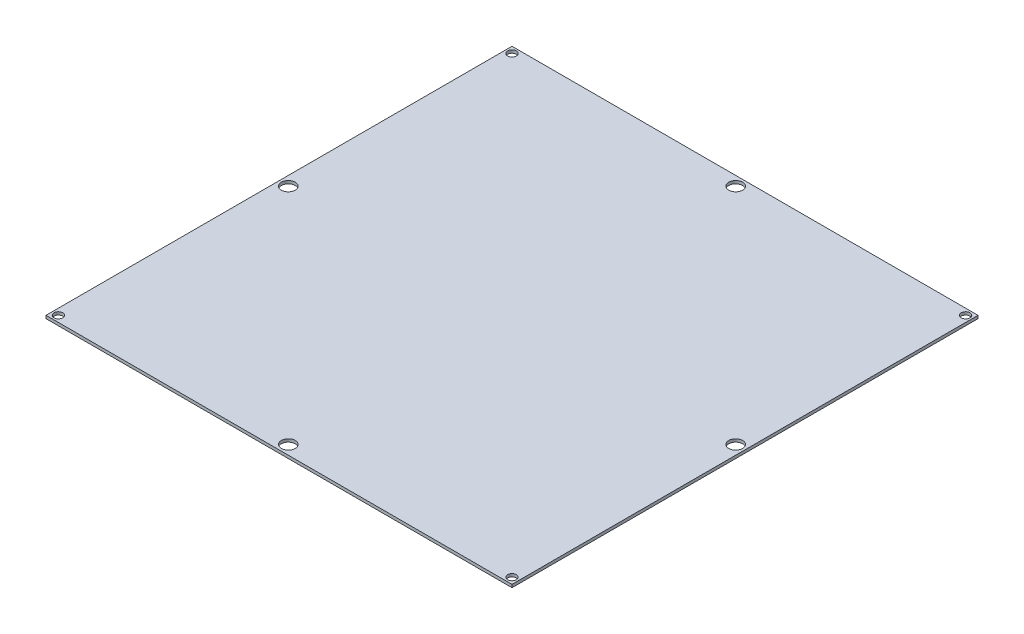
ISO-10303-21;
HEADER;
FILE_DESCRIPTION(('STEP AP214'),'2;1');
FILE_NAME('part.step','',(''),(''),'','','');
FILE_SCHEMA(('AUTOMOTIVE_DESIGN { 1 0 10303 214 1 1 1 1 }'));
ENDSEC;
DATA;
#1=APPLICATION_CONTEXT('core data for automotive mechanical design processes');
#2=APPLICATION_PROTOCOL_DEFINITION('international standard','automotive_design',2000,#1);
#3=PRODUCT_CONTEXT('',#1,'mechanical');
#4=PRODUCT('Part','Part','',(#3));
#5=PRODUCT_RELATED_PRODUCT_CATEGORY('part','',(#4));
#6=PRODUCT_DEFINITION_FORMATION('','',#4);
#7=PRODUCT_DEFINITION_CONTEXT('part definition',#1,'design');
#8=PRODUCT_DEFINITION('design','',#6,#7);
#9=PRODUCT_DEFINITION_SHAPE('','',#8);
#10=(LENGTH_UNIT() NAMED_UNIT(*) SI_UNIT(.MILLI.,.METRE.));
#11=(NAMED_UNIT(*) PLANE_ANGLE_UNIT() SI_UNIT($,.RADIAN.));
#12=(NAMED_UNIT(*) SI_UNIT($,.STERADIAN.) SOLID_ANGLE_UNIT());
#13=UNCERTAINTY_MEASURE_WITH_UNIT(LENGTH_MEASURE(1.E-05),#10,'distance_accuracy_value','');
#14=(GEOMETRIC_REPRESENTATION_CONTEXT(3) GLOBAL_UNCERTAINTY_ASSIGNED_CONTEXT((#13)) GLOBAL_UNIT_ASSIGNED_CONTEXT((#10,
#11,#12)) REPRESENTATION_CONTEXT('',''));
#15=CARTESIAN_POINT('',(0.,0.,0.));
#16=DIRECTION('',(0.,0.,1.));
#17=DIRECTION('',(1.,0.,0.));
#18=AXIS2_PLACEMENT_3D('',#15,#16,#17);
#19=CARTESIAN_POINT('',(0.,1.2,0.));
#20=DIRECTION('',(0.,-1.,0.));
#21=DIRECTION('',(0.,0.,-1.));
#22=AXIS2_PLACEMENT_3D('',#19,#20,#21);
#23=PLANE('',#22);
#24=DIRECTION('',(0.,0.,1.));
#25=VECTOR('',#24,1.);
#26=CARTESIAN_POINT('',(0.,1.2,0.));
#27=LINE('',#26,#25);
#28=CARTESIAN_POINT('',(0.,1.2,-190.5));
#29=VERTEX_POINT('',#28);
#30=CARTESIAN_POINT('',(0.,1.2,0.));
#31=VERTEX_POINT('',#30);
#32=EDGE_CURVE('E85',#29,#31,#27,.T.);
#33=ORIENTED_EDGE('',*,*,#32,.T.);
#34=DIRECTION('',(1.,0.,0.));
#35=VECTOR('',#34,1.);
#36=CARTESIAN_POINT('',(0.,1.2,0.));
#37=LINE('',#36,#35);
#38=CARTESIAN_POINT('',(190.5,1.2,0.));
#39=VERTEX_POINT('',#38);
#40=EDGE_CURVE('E80',#31,#39,#37,.T.);
#41=ORIENTED_EDGE('',*,*,#40,.T.);
#42=DIRECTION('',(0.,0.,-1.));
#43=VECTOR('',#42,1.);
#44=CARTESIAN_POINT('',(190.5,1.2,0.));
#45=LINE('',#44,#43);
#46=CARTESIAN_POINT('',(190.5,1.2,-190.5));
#47=VERTEX_POINT('',#46);
#48=EDGE_CURVE('E83',#39,#47,#45,.T.);
#49=ORIENTED_EDGE('',*,*,#48,.T.);
#50=DIRECTION('',(-1.,0.,0.));
#51=VECTOR('',#50,1.);
#52=CARTESIAN_POINT('',(0.,1.2,-190.5));
#53=LINE('',#52,#51);
#54=EDGE_CURVE('E50',#47,#29,#53,.T.);
#55=ORIENTED_EDGE('',*,*,#54,.T.);
#56=EDGE_LOOP('',(#33,#41,#49,#55));
#57=FACE_BOUND('',#56,.T.);
#58=CARTESIAN_POINT('',(2.53999999999999,1.2,-187.96));
#59=DIRECTION('',(0.,1.,0.));
#60=DIRECTION('',(0.,0.,1.));
#61=AXIS2_PLACEMENT_3D('',#58,#59,#60);
#62=CIRCLE('',#61,1.796);
#63=CARTESIAN_POINT('',(2.53999999999999,1.2,-186.164));
#64=VERTEX_POINT('',#63);
#65=EDGE_CURVE('E100',#64,#64,#62,.T.);
#66=ORIENTED_EDGE('',*,*,#65,.F.);
#67=EDGE_LOOP('',(#66));
#68=FACE_BOUND('',#67,.T.);
#69=CARTESIAN_POINT('',(187.96,1.2,-187.96));
#70=DIRECTION('',(0.,1.,0.));
#71=DIRECTION('',(0.,0.,1.));
#72=AXIS2_PLACEMENT_3D('',#69,#70,#71);
#73=CIRCLE('',#72,1.79599999999999);
#74=CARTESIAN_POINT('',(187.96,1.2,-186.164));
#75=VERTEX_POINT('',#74);
#76=EDGE_CURVE('E115',#75,#75,#73,.T.);
#77=ORIENTED_EDGE('',*,*,#76,.F.);
#78=EDGE_LOOP('',(#77));
#79=FACE_BOUND('',#78,.T.);
#80=CARTESIAN_POINT('',(187.96,1.2,-2.53999999999999));
#81=DIRECTION('',(0.,1.,0.));
#82=DIRECTION('',(0.,0.,1.));
#83=AXIS2_PLACEMENT_3D('',#80,#81,#82);
#84=CIRCLE('',#83,1.79599999999999);
#85=CARTESIAN_POINT('',(187.96,1.2,-0.743999999999995));
#86=VERTEX_POINT('',#85);
#87=EDGE_CURVE('E121',#86,#86,#84,.T.);
#88=ORIENTED_EDGE('',*,*,#87,.F.);
#89=EDGE_LOOP('',(#88));
#90=FACE_BOUND('',#89,.T.);
#91=CARTESIAN_POINT('',(2.54,1.2,-2.54));
#92=DIRECTION('',(0.,1.,0.));
#93=DIRECTION('',(0.,0.,1.));
#94=AXIS2_PLACEMENT_3D('',#91,#92,#93);
#95=CIRCLE('',#94,1.796);
#96=CARTESIAN_POINT('',(2.54,1.2,-0.744000000000001));
#97=VERTEX_POINT('',#96);
#98=EDGE_CURVE('E127',#97,#97,#95,.T.);
#99=ORIENTED_EDGE('',*,*,#98,.F.);
#100=EDGE_LOOP('',(#99));
#101=FACE_BOUND('',#100,.T.);
#102=CARTESIAN_POINT('',(95.25,1.2,-186.69));
#103=DIRECTION('',(0.,1.,0.));
#104=DIRECTION('',(0.,0.,1.));
#105=AXIS2_PLACEMENT_3D('',#102,#103,#104);
#106=CIRCLE('',#105,2.83999999999999);
#107=CARTESIAN_POINT('',(95.25,1.2,-183.85));
#108=VERTEX_POINT('',#107);
#109=EDGE_CURVE('E133',#108,#108,#106,.T.);
#110=ORIENTED_EDGE('',*,*,#109,.F.);
#111=EDGE_LOOP('',(#110));
#112=FACE_BOUND('',#111,.T.);
#113=CARTESIAN_POINT('',(3.81,1.2,-95.25));
#114=DIRECTION('',(0.,1.,0.));
#115=DIRECTION('',(0.,0.,1.));
#116=AXIS2_PLACEMENT_3D('',#113,#114,#115);
#117=CIRCLE('',#116,2.84);
#118=CARTESIAN_POINT('',(3.81,1.2,-92.41));
#119=VERTEX_POINT('',#118);
#120=EDGE_CURVE('E139',#119,#119,#117,.T.);
#121=ORIENTED_EDGE('',*,*,#120,.F.);
#122=EDGE_LOOP('',(#121));
#123=FACE_BOUND('',#122,.T.);
#124=CARTESIAN_POINT('',(95.25,1.2,-3.81000000000001));
#125=DIRECTION('',(0.,1.,0.));
#126=DIRECTION('',(0.,0.,-1.));
#127=AXIS2_PLACEMENT_3D('',#124,#125,#126);
#128=CIRCLE('',#127,2.83999999999999);
#129=CARTESIAN_POINT('',(95.25,1.2,-6.65));
#130=VERTEX_POINT('',#129);
#131=EDGE_CURVE('E145',#130,#130,#128,.T.);
#132=ORIENTED_EDGE('',*,*,#131,.F.);
#133=EDGE_LOOP('',(#132));
#134=FACE_BOUND('',#133,.T.);
#135=CARTESIAN_POINT('',(186.69,1.2,-95.25));
#136=DIRECTION('',(0.,1.,0.));
#137=DIRECTION('',(0.,0.,-1.));
#138=AXIS2_PLACEMENT_3D('',#135,#136,#137);
#139=CIRCLE('',#138,2.83999999999999);
#140=CARTESIAN_POINT('',(186.69,1.2,-98.09));
#141=VERTEX_POINT('',#140);
#142=EDGE_CURVE('E151',#141,#141,#139,.T.);
#143=ORIENTED_EDGE('',*,*,#142,.F.);
#144=EDGE_LOOP('',(#143));
#145=FACE_BOUND('',#144,.T.);
#146=ADVANCED_FACE('F33',(#57,#68,#79,#90,#101,#112,#123,#134,#145),#23,.F.);
#147=CARTESIAN_POINT('',(0.,0.,0.));
#148=DIRECTION('',(0.,-1.,0.));
#149=DIRECTION('',(0.,0.,-1.));
#150=AXIS2_PLACEMENT_3D('',#147,#148,#149);
#151=PLANE('',#150);
#152=CARTESIAN_POINT('',(95.25,0.,-3.81000000000001));
#153=DIRECTION('',(0.,1.,0.));
#154=DIRECTION('',(0.,0.,-1.));
#155=AXIS2_PLACEMENT_3D('',#152,#153,#154);
#156=CIRCLE('',#155,2.83999999999999);
#157=CARTESIAN_POINT('',(95.25,0.,-6.65));
#158=VERTEX_POINT('',#157);
#159=EDGE_CURVE('E148',#158,#158,#156,.T.);
#160=ORIENTED_EDGE('',*,*,#159,.T.);
#161=EDGE_LOOP('',(#160));
#162=FACE_BOUND('',#161,.T.);
#163=CARTESIAN_POINT('',(95.25,0.,-186.69));
#164=DIRECTION('',(0.,1.,0.));
#165=DIRECTION('',(0.,0.,1.));
#166=AXIS2_PLACEMENT_3D('',#163,#164,#165);
#167=CIRCLE('',#166,2.83999999999999);
#168=CARTESIAN_POINT('',(95.25,0.,-183.85));
#169=VERTEX_POINT('',#168);
#170=EDGE_CURVE('E136',#169,#169,#167,.T.);
#171=ORIENTED_EDGE('',*,*,#170,.T.);
#172=EDGE_LOOP('',(#171));
#173=FACE_BOUND('',#172,.T.);
#174=CARTESIAN_POINT('',(187.96,0.,-2.53999999999999));
#175=DIRECTION('',(0.,1.,0.));
#176=DIRECTION('',(0.,0.,1.));
#177=AXIS2_PLACEMENT_3D('',#174,#175,#176);
#178=CIRCLE('',#177,1.79599999999999);
#179=CARTESIAN_POINT('',(187.96,0.,-0.743999999999995));
#180=VERTEX_POINT('',#179);
#181=EDGE_CURVE('E124',#180,#180,#178,.T.);
#182=ORIENTED_EDGE('',*,*,#181,.T.);
#183=EDGE_LOOP('',(#182));
#184=FACE_BOUND('',#183,.T.);
#185=CARTESIAN_POINT('',(2.53999999999999,0.,-187.96));
#186=DIRECTION('',(0.,1.,0.));
#187=DIRECTION('',(0.,0.,1.));
#188=AXIS2_PLACEMENT_3D('',#185,#186,#187);
#189=CIRCLE('',#188,1.796);
#190=CARTESIAN_POINT('',(2.53999999999999,0.,-186.164));
#191=VERTEX_POINT('',#190);
#192=EDGE_CURVE('E112',#191,#191,#189,.T.);
#193=ORIENTED_EDGE('',*,*,#192,.T.);
#194=EDGE_LOOP('',(#193));
#195=FACE_BOUND('',#194,.T.);
#196=DIRECTION('',(0.,0.,1.));
#197=VECTOR('',#196,1.);
#198=CARTESIAN_POINT('',(0.,0.,0.));
#199=LINE('',#198,#197);
#200=CARTESIAN_POINT('',(0.,0.,-190.5));
#201=VERTEX_POINT('',#200);
#202=CARTESIAN_POINT('',(0.,0.,0.));
#203=VERTEX_POINT('',#202);
#204=EDGE_CURVE('E97',#201,#203,#199,.T.);
#205=ORIENTED_EDGE('',*,*,#204,.F.);
#206=DIRECTION('',(-1.,0.,0.));
#207=VECTOR('',#206,1.);
#208=CARTESIAN_POINT('',(0.,0.,-190.5));
#209=LINE('',#208,#207);
#210=CARTESIAN_POINT('',(190.5,0.,-190.5));
#211=VERTEX_POINT('',#210);
#212=EDGE_CURVE('E73',#211,#201,#209,.T.);
#213=ORIENTED_EDGE('',*,*,#212,.F.);
#214=DIRECTION('',(0.,0.,-1.));
#215=VECTOR('',#214,1.);
#216=CARTESIAN_POINT('',(190.5,0.,0.));
#217=LINE('',#216,#215);
#218=CARTESIAN_POINT('',(190.5,0.,0.));
#219=VERTEX_POINT('',#218);
#220=EDGE_CURVE('E67',#219,#211,#217,.T.);
#221=ORIENTED_EDGE('',*,*,#220,.F.);
#222=DIRECTION('',(1.,0.,0.));
#223=VECTOR('',#222,1.);
#224=CARTESIAN_POINT('',(0.,0.,0.));
#225=LINE('',#224,#223);
#226=EDGE_CURVE('E89',#203,#219,#225,.T.);
#227=ORIENTED_EDGE('',*,*,#226,.F.);
#228=EDGE_LOOP('',(#205,#213,#221,#227));
#229=FACE_BOUND('',#228,.T.);
#230=CARTESIAN_POINT('',(187.96,0.,-187.96));
#231=DIRECTION('',(0.,1.,0.));
#232=DIRECTION('',(0.,0.,1.));
#233=AXIS2_PLACEMENT_3D('',#230,#231,#232);
#234=CIRCLE('',#233,1.79599999999999);
#235=CARTESIAN_POINT('',(187.96,0.,-186.164));
#236=VERTEX_POINT('',#235);
#237=EDGE_CURVE('E118',#236,#236,#234,.T.);
#238=ORIENTED_EDGE('',*,*,#237,.T.);
#239=EDGE_LOOP('',(#238));
#240=FACE_BOUND('',#239,.T.);
#241=CARTESIAN_POINT('',(2.54,0.,-2.54));
#242=DIRECTION('',(0.,1.,0.));
#243=DIRECTION('',(0.,0.,1.));
#244=AXIS2_PLACEMENT_3D('',#241,#242,#243);
#245=CIRCLE('',#244,1.796);
#246=CARTESIAN_POINT('',(2.54,0.,-0.744000000000001));
#247=VERTEX_POINT('',#246);
#248=EDGE_CURVE('E130',#247,#247,#245,.T.);
#249=ORIENTED_EDGE('',*,*,#248,.T.);
#250=EDGE_LOOP('',(#249));
#251=FACE_BOUND('',#250,.T.);
#252=CARTESIAN_POINT('',(3.81,0.,-95.25));
#253=DIRECTION('',(0.,1.,0.));
#254=DIRECTION('',(0.,0.,1.));
#255=AXIS2_PLACEMENT_3D('',#252,#253,#254);
#256=CIRCLE('',#255,2.84);
#257=CARTESIAN_POINT('',(3.81,0.,-92.41));
#258=VERTEX_POINT('',#257);
#259=EDGE_CURVE('E142',#258,#258,#256,.T.);
#260=ORIENTED_EDGE('',*,*,#259,.T.);
#261=EDGE_LOOP('',(#260));
#262=FACE_BOUND('',#261,.T.);
#263=CARTESIAN_POINT('',(186.69,0.,-95.25));
#264=DIRECTION('',(0.,1.,0.));
#265=DIRECTION('',(0.,0.,-1.));
#266=AXIS2_PLACEMENT_3D('',#263,#264,#265);
#267=CIRCLE('',#266,2.83999999999999);
#268=CARTESIAN_POINT('',(186.69,0.,-98.09));
#269=VERTEX_POINT('',#268);
#270=EDGE_CURVE('E154',#269,#269,#267,.T.);
#271=ORIENTED_EDGE('',*,*,#270,.T.);
#272=EDGE_LOOP('',(#271));
#273=FACE_BOUND('',#272,.T.);
#274=ADVANCED_FACE('F108',(#162,#173,#184,#195,#229,#240,#251,#262,#273),#151,.T.);
#275=CARTESIAN_POINT('',(0.,1.2,0.));
#276=DIRECTION('',(1.,0.,0.));
#277=DIRECTION('',(0.,0.,-1.));
#278=AXIS2_PLACEMENT_3D('',#275,#276,#277);
#279=PLANE('',#278);
#280=ORIENTED_EDGE('',*,*,#204,.T.);
#281=DIRECTION('',(0.,-1.,0.));
#282=VECTOR('',#281,1.);
#283=CARTESIAN_POINT('',(0.,1.2,0.));
#284=LINE('',#283,#282);
#285=EDGE_CURVE('E11',#31,#203,#284,.T.);
#286=ORIENTED_EDGE('',*,*,#285,.F.);
#287=ORIENTED_EDGE('',*,*,#32,.F.);
#288=DIRECTION('',(0.,-1.,0.));
#289=VECTOR('',#288,1.);
#290=CARTESIAN_POINT('',(0.,1.2,-190.5));
#291=LINE('',#290,#289);
#292=EDGE_CURVE('E93',#29,#201,#291,.T.);
#293=ORIENTED_EDGE('',*,*,#292,.T.);
#294=EDGE_LOOP('',(#280,#286,#287,#293));
#295=FACE_BOUND('',#294,.T.);
#296=ADVANCED_FACE('F35',(#295),#279,.F.);
#297=CARTESIAN_POINT('',(0.,1.2,0.));
#298=DIRECTION('',(0.,0.,-1.));
#299=DIRECTION('',(-1.,0.,0.));
#300=AXIS2_PLACEMENT_3D('',#297,#298,#299);
#301=PLANE('',#300);
#302=ORIENTED_EDGE('',*,*,#226,.T.);
#303=DIRECTION('',(0.,-1.,0.));
#304=VECTOR('',#303,1.);
#305=CARTESIAN_POINT('',(190.5,1.2,0.));
#306=LINE('',#305,#304);
#307=EDGE_CURVE('E42',#39,#219,#306,.T.);
#308=ORIENTED_EDGE('',*,*,#307,.F.);
#309=ORIENTED_EDGE('',*,*,#40,.F.);
#310=ORIENTED_EDGE('',*,*,#285,.T.);
#311=EDGE_LOOP('',(#302,#308,#309,#310));
#312=FACE_BOUND('',#311,.T.);
#313=ADVANCED_FACE('F88',(#312),#301,.F.);
#314=CARTESIAN_POINT('',(190.5,1.2,0.));
#315=DIRECTION('',(-1.,0.,0.));
#316=DIRECTION('',(0.,0.,1.));
#317=AXIS2_PLACEMENT_3D('',#314,#315,#316);
#318=PLANE('',#317);
#319=ORIENTED_EDGE('',*,*,#220,.T.);
#320=DIRECTION('',(0.,-1.,0.));
#321=VECTOR('',#320,1.);
#322=CARTESIAN_POINT('',(190.5,1.2,-190.5));
#323=LINE('',#322,#321);
#324=EDGE_CURVE('E90',#47,#211,#323,.T.);
#325=ORIENTED_EDGE('',*,*,#324,.F.);
#326=ORIENTED_EDGE('',*,*,#48,.F.);
#327=ORIENTED_EDGE('',*,*,#307,.T.);
#328=EDGE_LOOP('',(#319,#325,#326,#327));
#329=FACE_BOUND('',#328,.T.);
#330=ADVANCED_FACE('F91',(#329),#318,.F.);
#331=CARTESIAN_POINT('',(0.,1.2,-190.5));
#332=DIRECTION('',(0.,0.,1.));
#333=DIRECTION('',(1.,0.,0.));
#334=AXIS2_PLACEMENT_3D('',#331,#332,#333);
#335=PLANE('',#334);
#336=ORIENTED_EDGE('',*,*,#212,.T.);
#337=ORIENTED_EDGE('',*,*,#292,.F.);
#338=ORIENTED_EDGE('',*,*,#54,.F.);
#339=ORIENTED_EDGE('',*,*,#324,.T.);
#340=EDGE_LOOP('',(#336,#337,#338,#339));
#341=FACE_BOUND('',#340,.T.);
#342=ADVANCED_FACE('F105',(#341),#335,.F.);
#343=CARTESIAN_POINT('',(2.53999999999999,1.2,-187.96));
#344=DIRECTION('',(0.,-1.,0.));
#345=DIRECTION('',(0.,0.,-1.));
#346=AXIS2_PLACEMENT_3D('',#343,#344,#345);
#347=CYLINDRICAL_SURFACE('',#346,1.796);
#348=ORIENTED_EDGE('',*,*,#65,.T.);
#349=EDGE_LOOP('',(#348));
#350=FACE_BOUND('',#349,.T.);
#351=ORIENTED_EDGE('',*,*,#192,.F.);
#352=EDGE_LOOP('',(#351));
#353=FACE_BOUND('',#352,.T.);
#354=ADVANCED_FACE('F171',(#350,#353),#347,.F.);
#355=CARTESIAN_POINT('',(187.96,1.2,-187.96));
#356=DIRECTION('',(0.,-1.,0.));
#357=DIRECTION('',(0.,0.,-1.));
#358=AXIS2_PLACEMENT_3D('',#355,#356,#357);
#359=CYLINDRICAL_SURFACE('',#358,1.79599999999999);
#360=ORIENTED_EDGE('',*,*,#76,.T.);
#361=EDGE_LOOP('',(#360));
#362=FACE_BOUND('',#361,.T.);
#363=ORIENTED_EDGE('',*,*,#237,.F.);
#364=EDGE_LOOP('',(#363));
#365=FACE_BOUND('',#364,.T.);
#366=ADVANCED_FACE('F217',(#362,#365),#359,.F.);
#367=CARTESIAN_POINT('',(187.96,1.2,-2.53999999999999));
#368=DIRECTION('',(0.,-1.,0.));
#369=DIRECTION('',(0.,0.,-1.));
#370=AXIS2_PLACEMENT_3D('',#367,#368,#369);
#371=CYLINDRICAL_SURFACE('',#370,1.79599999999999);
#372=ORIENTED_EDGE('',*,*,#87,.T.);
#373=EDGE_LOOP('',(#372));
#374=FACE_BOUND('',#373,.T.);
#375=ORIENTED_EDGE('',*,*,#181,.F.);
#376=EDGE_LOOP('',(#375));
#377=FACE_BOUND('',#376,.T.);
#378=ADVANCED_FACE('F225',(#374,#377),#371,.F.);
#379=CARTESIAN_POINT('',(2.54,1.2,-2.54));
#380=DIRECTION('',(0.,-1.,0.));
#381=DIRECTION('',(0.,0.,-1.));
#382=AXIS2_PLACEMENT_3D('',#379,#380,#381);
#383=CYLINDRICAL_SURFACE('',#382,1.796);
#384=ORIENTED_EDGE('',*,*,#98,.T.);
#385=EDGE_LOOP('',(#384));
#386=FACE_BOUND('',#385,.T.);
#387=ORIENTED_EDGE('',*,*,#248,.F.);
#388=EDGE_LOOP('',(#387));
#389=FACE_BOUND('',#388,.T.);
#390=ADVANCED_FACE('F233',(#386,#389),#383,.F.);
#391=CARTESIAN_POINT('',(95.25,1.2,-186.69));
#392=DIRECTION('',(0.,-1.,0.));
#393=DIRECTION('',(0.,0.,-1.));
#394=AXIS2_PLACEMENT_3D('',#391,#392,#393);
#395=CYLINDRICAL_SURFACE('',#394,2.83999999999999);
#396=ORIENTED_EDGE('',*,*,#109,.T.);
#397=EDGE_LOOP('',(#396));
#398=FACE_BOUND('',#397,.T.);
#399=ORIENTED_EDGE('',*,*,#170,.F.);
#400=EDGE_LOOP('',(#399));
#401=FACE_BOUND('',#400,.T.);
#402=ADVANCED_FACE('F242',(#398,#401),#395,.F.);
#403=CARTESIAN_POINT('',(3.81,1.2,-95.25));
#404=DIRECTION('',(0.,-1.,0.));
#405=DIRECTION('',(0.,0.,-1.));
#406=AXIS2_PLACEMENT_3D('',#403,#404,#405);
#407=CYLINDRICAL_SURFACE('',#406,2.84);
#408=ORIENTED_EDGE('',*,*,#120,.T.);
#409=EDGE_LOOP('',(#408));
#410=FACE_BOUND('',#409,.T.);
#411=ORIENTED_EDGE('',*,*,#259,.F.);
#412=EDGE_LOOP('',(#411));
#413=FACE_BOUND('',#412,.T.);
#414=ADVANCED_FACE('F251',(#410,#413),#407,.F.);
#415=CARTESIAN_POINT('',(95.25,1.2,-3.81000000000001));
#416=DIRECTION('',(0.,-1.,0.));
#417=DIRECTION('',(0.,0.,-1.));
#418=AXIS2_PLACEMENT_3D('',#415,#416,#417);
#419=CYLINDRICAL_SURFACE('',#418,2.83999999999999);
#420=ORIENTED_EDGE('',*,*,#131,.T.);
#421=EDGE_LOOP('',(#420));
#422=FACE_BOUND('',#421,.T.);
#423=ORIENTED_EDGE('',*,*,#159,.F.);
#424=EDGE_LOOP('',(#423));
#425=FACE_BOUND('',#424,.T.);
#426=ADVANCED_FACE('F260',(#422,#425),#419,.F.);
#427=CARTESIAN_POINT('',(186.69,1.2,-95.25));
#428=DIRECTION('',(0.,-1.,0.));
#429=DIRECTION('',(0.,0.,-1.));
#430=AXIS2_PLACEMENT_3D('',#427,#428,#429);
#431=CYLINDRICAL_SURFACE('',#430,2.83999999999999);
#432=ORIENTED_EDGE('',*,*,#142,.T.);
#433=EDGE_LOOP('',(#432));
#434=FACE_BOUND('',#433,.T.);
#435=ORIENTED_EDGE('',*,*,#270,.F.);
#436=EDGE_LOOP('',(#435));
#437=FACE_BOUND('',#436,.T.);
#438=ADVANCED_FACE('F160',(#434,#437),#431,.F.);
#439=CLOSED_SHELL('',(#146,#274,#296,#313,#330,#342,#354,#366,#378,#390,#402,#414,#426,#438));
#440=MANIFOLD_SOLID_BREP('B2',#439);
#441=ADVANCED_BREP_SHAPE_REPRESENTATION('',(#18,#440),#14);
#442=SHAPE_DEFINITION_REPRESENTATION(#9,#441);
ENDSEC;
END-ISO-10303-21;
